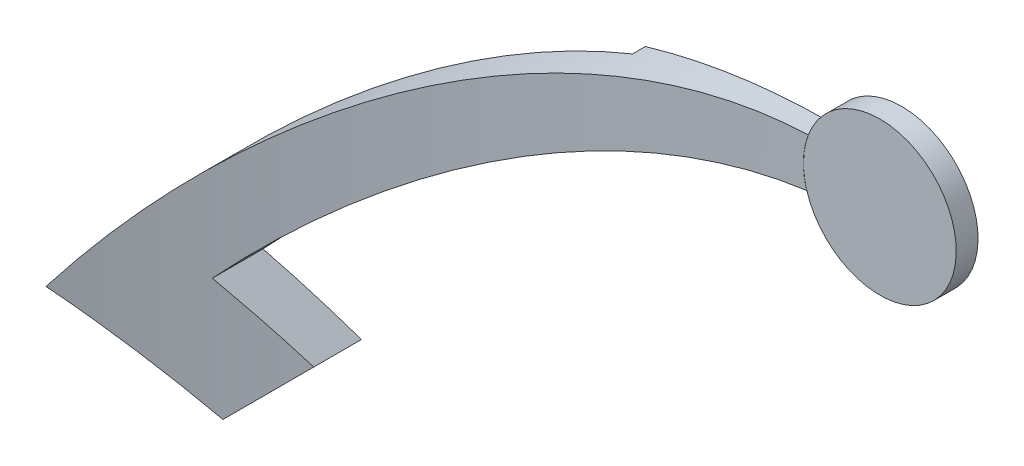
ISO-10303-21;
HEADER;
FILE_DESCRIPTION(('STEP AP214'),'2;1');
FILE_NAME('part.step','',(''),(''),'','','');
FILE_SCHEMA(('AUTOMOTIVE_DESIGN { 1 0 10303 214 1 1 1 1 }'));
ENDSEC;
DATA;
#1=APPLICATION_CONTEXT('core data for automotive mechanical design processes');
#2=APPLICATION_PROTOCOL_DEFINITION('international standard','automotive_design',2000,#1);
#3=PRODUCT_CONTEXT('',#1,'mechanical');
#4=PRODUCT('Part','Part','',(#3));
#5=PRODUCT_RELATED_PRODUCT_CATEGORY('part','',(#4));
#6=PRODUCT_DEFINITION_FORMATION('','',#4);
#7=PRODUCT_DEFINITION_CONTEXT('part definition',#1,'design');
#8=PRODUCT_DEFINITION('design','',#6,#7);
#9=PRODUCT_DEFINITION_SHAPE('','',#8);
#10=(LENGTH_UNIT() NAMED_UNIT(*) SI_UNIT(.MILLI.,.METRE.));
#11=(NAMED_UNIT(*) PLANE_ANGLE_UNIT() SI_UNIT($,.RADIAN.));
#12=(NAMED_UNIT(*) SI_UNIT($,.STERADIAN.) SOLID_ANGLE_UNIT());
#13=UNCERTAINTY_MEASURE_WITH_UNIT(LENGTH_MEASURE(1.E-05),#10,'distance_accuracy_value','');
#14=(GEOMETRIC_REPRESENTATION_CONTEXT(3) GLOBAL_UNCERTAINTY_ASSIGNED_CONTEXT((#13)) GLOBAL_UNIT_ASSIGNED_CONTEXT((#10,
#11,#12)) REPRESENTATION_CONTEXT('',''));
#15=CARTESIAN_POINT('',(0.,0.,0.));
#16=DIRECTION('',(0.,0.,1.));
#17=DIRECTION('',(1.,0.,0.));
#18=AXIS2_PLACEMENT_3D('',#15,#16,#17);
#19=CARTESIAN_POINT('',(-35.5840832931207,-35.5840832931207,45.));
#20=DIRECTION('',(-0.707106781186547,-0.707106781186548,0.));
#21=DIRECTION('',(0.707106781186548,-0.707106781186547,0.));
#22=AXIS2_PLACEMENT_3D('',#19,#20,#21);
#23=PLANE('',#22);
#24=DIRECTION('',(0.,0.,-1.));
#25=VECTOR('',#24,1.);
#26=CARTESIAN_POINT('',(-42.209094678882,-28.9590719073594,45.));
#27=LINE('',#26,#25);
#28=CARTESIAN_POINT('',(-42.209094678882,-28.9590719073594,11.6927556774547));
#29=VERTEX_POINT('',#28);
#30=CARTESIAN_POINT('',(-42.209094678882,-28.9590719073594,7.32366796733275));
#31=VERTEX_POINT('',#30);
#32=EDGE_CURVE('E184',#29,#31,#27,.T.);
#33=ORIENTED_EDGE('',*,*,#32,.T.);
#34=CARTESIAN_POINT('',(-9.9445485422876,-61.2236180439538,73.9490391903972));
#35=DIRECTION('',(-0.707106781186547,-0.707106781186548,0.));
#36=DIRECTION('',(-0.707106781186548,0.707106781186547,0.));
#37=AXIS2_PLACEMENT_3D('',#34,#35,#36);
#38=ELLIPSE('',#37,104.68945532394,74.0266237782838);
#39=CARTESIAN_POINT('',(-48.0616189933059,-23.1065475929356,10.4901551138261));
#40=VERTEX_POINT('',#39);
#41=EDGE_CURVE('E50',#31,#40,#38,.F.);
#42=ORIENTED_EDGE('',*,*,#41,.T.);
#43=DIRECTION('',(0.,0.,-1.));
#44=VECTOR('',#43,1.);
#45=CARTESIAN_POINT('',(-48.0616189933059,-23.1065475929356,45.));
#46=LINE('',#45,#44);
#47=CARTESIAN_POINT('',(-48.0616189933059,-23.1065475929356,15.1397981247711));
#48=VERTEX_POINT('',#47);
#49=EDGE_CURVE('E199',#48,#40,#46,.T.);
#50=ORIENTED_EDGE('',*,*,#49,.F.);
#51=CARTESIAN_POINT('',(-3.27411829727169,-67.8940482889697,84.4899350079603));
#52=DIRECTION('',(-0.707106781186547,-0.707106781186548,0.));
#53=DIRECTION('',(0.707106781186548,-0.707106781186547,0.));
#54=AXIS2_PLACEMENT_3D('',#51,#52,#53);
#55=ELLIPSE('',#54,116.750689114149,82.5552039808172);
#56=EDGE_CURVE('E173',#48,#29,#55,.T.);
#57=ORIENTED_EDGE('',*,*,#56,.T.);
#58=EDGE_LOOP('',(#33,#42,#50,#57));
#59=FACE_BOUND('',#58,.T.);
#60=ADVANCED_FACE('F35',(#59),#23,.F.);
#61=CARTESIAN_POINT('',(0.,0.,2.));
#62=DIRECTION('',(0.,0.,-1.));
#63=DIRECTION('',(-1.,0.,0.));
#64=AXIS2_PLACEMENT_3D('',#61,#62,#63);
#65=CYLINDRICAL_SURFACE('',#64,7.);
#66=DIRECTION('',(0.,0.,-1.));
#67=VECTOR('',#66,1.);
#68=CARTESIAN_POINT('',(-6.69917083103432,-2.03005176698009,45.));
#69=LINE('',#68,#67);
#70=CARTESIAN_POINT('',(-6.69917083103432,-2.03005176698009,2.));
#71=VERTEX_POINT('',#70);
#72=CARTESIAN_POINT('',(-6.69917083103432,-2.03005176698009,0.));
#73=VERTEX_POINT('',#72);
#74=EDGE_CURVE('E196',#71,#73,#69,.T.);
#75=ORIENTED_EDGE('',*,*,#74,.T.);
#76=CARTESIAN_POINT('',(0.,0.,0.));
#77=DIRECTION('',(0.,0.,1.));
#78=DIRECTION('',(1.,0.,0.));
#79=AXIS2_PLACEMENT_3D('',#76,#77,#78);
#80=CIRCLE('',#79,7.);
#81=CARTESIAN_POINT('',(-6.55624058274921,2.45269431872631,0.));
#82=VERTEX_POINT('',#81);
#83=EDGE_CURVE('E202',#73,#82,#80,.T.);
#84=ORIENTED_EDGE('',*,*,#83,.T.);
#85=DIRECTION('',(0.,0.,-1.));
#86=VECTOR('',#85,1.);
#87=CARTESIAN_POINT('',(-6.55624058274921,2.45269431872631,45.));
#88=LINE('',#87,#86);
#89=CARTESIAN_POINT('',(-6.55624058274921,2.45269431872631,2.));
#90=VERTEX_POINT('',#89);
#91=EDGE_CURVE('E193',#90,#82,#88,.T.);
#92=ORIENTED_EDGE('',*,*,#91,.F.);
#93=CARTESIAN_POINT('',(0.,0.,2.));
#94=DIRECTION('',(0.,0.,1.));
#95=DIRECTION('',(1.,0.,0.));
#96=AXIS2_PLACEMENT_3D('',#93,#94,#95);
#97=CIRCLE('',#96,7.);
#98=EDGE_CURVE('E207',#71,#90,#97,.T.);
#99=ORIENTED_EDGE('',*,*,#98,.F.);
#100=EDGE_LOOP('',(#75,#84,#92,#99));
#101=FACE_BOUND('',#100,.T.);
#102=ADVANCED_FACE('F37',(#101),#65,.T.);
#103=CARTESIAN_POINT('',(0.,0.,2.));
#104=DIRECTION('',(0.,0.,1.));
#105=DIRECTION('',(1.,0.,0.));
#106=AXIS2_PLACEMENT_3D('',#103,#104,#105);
#107=PLANE('',#106);
#108=ORIENTED_EDGE('',*,*,#98,.T.);
#109=EDGE_CURVE('E203',#90,#71,#97,.T.);
#110=ORIENTED_EDGE('',*,*,#109,.T.);
#111=EDGE_LOOP('',(#108,#110));
#112=FACE_BOUND('',#111,.T.);
#113=ADVANCED_FACE('F226',(#112),#107,.T.);
#114=CARTESIAN_POINT('',(0.,0.,0.));
#115=DIRECTION('',(0.,0.,1.));
#116=DIRECTION('',(1.,0.,0.));
#117=AXIS2_PLACEMENT_3D('',#114,#115,#116);
#118=PLANE('',#117);
#119=CARTESIAN_POINT('',(-0.329565776706658,-65.6553273861561,0.));
#120=DIRECTION('',(0.,0.,1.));
#121=DIRECTION('',(1.,0.,0.));
#122=AXIS2_PLACEMENT_3D('',#119,#120,#121);
#123=CIRCLE('',#122,63.9433152578456);
#124=CARTESIAN_POINT('',(-13.3328565018262,-3.04812335593085,0.));
#125=VERTEX_POINT('',#124);
#126=EDGE_CURVE('E121',#125,#73,#123,.F.);
#127=ORIENTED_EDGE('',*,*,#126,.F.);
#128=DIRECTION('',(0.,1.,0.));
#129=VECTOR('',#128,1.);
#130=CARTESIAN_POINT('',(-13.3328565018262,-34.220255051597,0.));
#131=LINE('',#130,#129);
#132=CARTESIAN_POINT('',(-13.3328565018262,0.,0.));
#133=VERTEX_POINT('',#132);
#134=EDGE_CURVE('E105',#125,#133,#131,.T.);
#135=ORIENTED_EDGE('',*,*,#134,.T.);
#136=DIRECTION('',(-1.,0.,0.));
#137=VECTOR('',#136,1.);
#138=CARTESIAN_POINT('',(0.,0.,0.));
#139=LINE('',#138,#137);
#140=CARTESIAN_POINT('',(-23.4995027128291,0.,0.));
#141=VERTEX_POINT('',#140);
#142=EDGE_CURVE('E110',#133,#141,#139,.T.);
#143=ORIENTED_EDGE('',*,*,#142,.T.);
#144=CARTESIAN_POINT('',(-6.53554864061653,-57.4387925220281,0.));
#145=DIRECTION('',(0.,0.,1.));
#146=DIRECTION('',(1.,0.,0.));
#147=AXIS2_PLACEMENT_3D('',#144,#145,#146);
#148=CIRCLE('',#147,59.8914904151894);
#149=EDGE_CURVE('E182',#82,#141,#148,.T.);
#150=ORIENTED_EDGE('',*,*,#149,.F.);
#151=ORIENTED_EDGE('',*,*,#83,.F.);
#152=EDGE_LOOP('',(#127,#135,#143,#150,#151));
#153=FACE_BOUND('',#152,.T.);
#154=ADVANCED_FACE('F119',(#153),#118,.F.);
#155=CARTESIAN_POINT('',(-0.329565776706658,-65.6553273861561,45.));
#156=DIRECTION('',(0.,0.,-1.));
#157=DIRECTION('',(-1.,0.,0.));
#158=AXIS2_PLACEMENT_3D('',#155,#156,#157);
#159=CYLINDRICAL_SURFACE('',#158,63.9433152578456);
#160=ORIENTED_EDGE('',*,*,#49,.T.);
#161=CARTESIAN_POINT('',(-48.0616189933059,-23.1065475929356,10.4901551138261));
#162=CARTESIAN_POINT('',(-47.5076406890203,-22.4850994987697,10.1573967660847));
#163=CARTESIAN_POINT('',(-46.9409325879899,-21.8737747227003,9.82687760220049));
#164=CARTESIAN_POINT('',(-45.782206093157,-20.6719722519872,9.17214532539775));
#165=CARTESIAN_POINT('',(-45.1901853173552,-20.0814965288909,8.84793281014923));
#166=CARTESIAN_POINT('',(-43.9806025660395,-18.9216452307571,8.20744828710972));
#167=CARTESIAN_POINT('',(-43.3630204901772,-18.3522869552314,7.89118285514154));
#168=CARTESIAN_POINT('',(-42.1030835501203,-17.2360209890771,7.26873119161367));
#169=CARTESIAN_POINT('',(-41.4607294297363,-16.689112625379,6.96254465793376));
#170=CARTESIAN_POINT('',(-39.536754127791,-15.115915963667,6.08010799750546));
#171=CARTESIAN_POINT('',(-38.2211181655229,-14.1215944669166,5.52017465086399));
#172=CARTESIAN_POINT('',(-35.5009304991416,-12.2281132423495,4.4584437653621));
#173=CARTESIAN_POINT('',(-34.0963957073024,-11.3289355006571,3.95663521983494));
#174=CARTESIAN_POINT('',(-31.9296588113765,-10.0596477819164,3.25837685623826));
#175=CARTESIAN_POINT('',(-31.1987199569451,-9.65042824258387,3.03503421630335));
#176=CARTESIAN_POINT('',(-29.71693296425,-8.8588883401176,2.60768986001694));
#177=CARTESIAN_POINT('',(-28.9660871117812,-8.47656490693388,2.40368593532536));
#178=CARTESIAN_POINT('',(-27.445552322729,-7.74000604859893,2.01663105946206));
#179=CARTESIAN_POINT('',(-26.6758653359426,-7.38576773297376,1.83357795120449));
#180=CARTESIAN_POINT('',(-25.1188685865181,-6.70654190927557,1.48997137957799));
#181=CARTESIAN_POINT('',(-24.3315610894292,-6.38155066744672,1.32941504275222));
#182=CARTESIAN_POINT('',(-22.7161133041659,-5.75236960568672,1.02768488826264));
#183=CARTESIAN_POINT('',(-21.8874623255342,-5.44912923802535,0.887260698509145));
#184=CARTESIAN_POINT('',(-20.2146169046235,-4.87610346817176,0.633402975491693));
#185=CARTESIAN_POINT('',(-19.3704229200604,-4.60631708261887,0.519968648786049));
#186=CARTESIAN_POINT('',(-17.6671953032793,-4.10092838630861,0.321344042496089));
#187=CARTESIAN_POINT('',(-16.8081416756833,-3.86537692416627,0.236195539072436));
#188=CARTESIAN_POINT('',(-15.078529959684,-3.42983120730705,0.0955509178788475));
#189=CARTESIAN_POINT('',(-14.2079700582759,-3.22984262963329,0.0400595315607913));
#190=CARTESIAN_POINT('',(-13.3328565018267,-3.04812335593097,0.));
#191=B_SPLINE_CURVE_WITH_KNOTS('',3,(#161,#162,#163,#164,#165,#166,#167,#168,#169,#170,#171,
#172,#173,#174,#175,#176,#177,#178,#179,#180,#181,#182,#183,#184,#185,#186,#187,#188,#189,#190),
.UNSPECIFIED.,.F.,.F.,(4,2,2,2,2,2,2,2,2,2,2,2,2,2,4),(0.,2.68954959187786,5.37935283796327,
8.07131298866402,10.7631923728453,15.9821761203666,21.2001699659842,23.8003228808297,
26.4001785186181,28.9997662352759,31.5990216097701,34.2783638967067,36.9576274072304,
39.6408305874597,42.3244617142018),.UNSPECIFIED.);
#192=EDGE_CURVE('E147',#40,#125,#191,.T.);
#193=ORIENTED_EDGE('',*,*,#192,.T.);
#194=ORIENTED_EDGE('',*,*,#126,.T.);
#195=ORIENTED_EDGE('',*,*,#74,.F.);
#196=CARTESIAN_POINT('',(-6.69917083103432,-2.03005176698009,2.00581096305508));
#197=VERTEX_POINT('',#196);
#198=EDGE_CURVE('E197',#197,#71,#69,.T.);
#199=ORIENTED_EDGE('',*,*,#198,.F.);
#200=CARTESIAN_POINT('',(-6.69917083103432,-2.0300517669801,2.00581096305508));
#201=CARTESIAN_POINT('',(-7.50254570219854,-2.11045431644717,2.03914462176974));
#202=CARTESIAN_POINT('',(-8.30388958942229,-2.20606949284512,2.0842011850145));
#203=CARTESIAN_POINT('',(-9.90074232476401,-2.42725628217593,2.19723148069816));
#204=CARTESIAN_POINT('',(-10.6962516442467,-2.55282544707744,2.26520334054011));
#205=CARTESIAN_POINT('',(-12.2791037424407,-2.83334235495889,2.42347218895302));
#206=CARTESIAN_POINT('',(-13.0664530360524,-2.98826439058415,2.51374966306348));
#207=CARTESIAN_POINT('',(-14.6321140831516,-3.3269537092637,2.71597428893903));
#208=CARTESIAN_POINT('',(-15.4104256961544,-3.51072144006247,2.82792177707356));
#209=CARTESIAN_POINT('',(-16.95035695795,-3.90483405955228,3.07172465749408));
#210=CARTESIAN_POINT('',(-17.7120603115694,-4.11495470164663,3.20341371879868));
#211=CARTESIAN_POINT('',(-19.2238345364824,-4.56215364233594,3.48647803843966));
#212=CARTESIAN_POINT('',(-19.9739041223335,-4.79923489609666,3.63785545508807));
#213=CARTESIAN_POINT('',(-22.2048845919056,-5.54976364517395,4.12015691543529));
#214=CARTESIAN_POINT('',(-23.6667641347681,-6.10254676299516,4.47928170988763));
#215=CARTESIAN_POINT('',(-26.525593155083,-7.30369828558628,5.26291197838196));
#216=CARTESIAN_POINT('',(-27.9227550493831,-7.95171977861777,5.68718040359195));
#217=CARTESIAN_POINT('',(-30.6520336196508,-9.33802934250386,6.59334469823989));
#218=CARTESIAN_POINT('',(-31.9841486741433,-10.0763196619563,7.07524200320756));
#219=CARTESIAN_POINT('',(-34.5817406210783,-11.6383061563908,8.08873743753809));
#220=CARTESIAN_POINT('',(-35.8470634434638,-12.4621878048498,8.62044324460001));
#221=CARTESIAN_POINT('',(-38.3047697558859,-14.1880013199949,9.72343989067866));
#222=CARTESIAN_POINT('',(-39.4971655692745,-15.0899199372923,10.2947240066823));
#223=CARTESIAN_POINT('',(-41.3219006512592,-16.5725272841568,11.2213000534085));
#224=CARTESIAN_POINT('',(-41.9791791583244,-17.1290876036939,11.5665665243754));
#225=CARTESIAN_POINT('',(-43.2681721597276,-18.2658576014905,12.2654610719787));
#226=CARTESIAN_POINT('',(-43.8998909396338,-18.8460632821407,12.6190877309878));
#227=CARTESIAN_POINT('',(-45.134866747434,-20.0268341469729,13.3313424293055));
#228=CARTESIAN_POINT('',(-45.7382361322276,-20.6272992324183,13.6899418442698));
#229=CARTESIAN_POINT('',(-46.9192783962792,-21.8504348711682,14.4118281310364));
#230=CARTESIAN_POINT('',(-47.4969484054507,-22.4731078907169,14.7751155205725));
#231=CARTESIAN_POINT('',(-48.0616189933059,-23.1065475929356,15.1397981247711));
#232=B_SPLINE_CURVE_WITH_KNOTS('',3,(#200,#201,#202,#203,#204,#205,#206,#207,#208,#209,#210,
#211,#212,#213,#214,#215,#216,#217,#218,#219,#220,#221,#222,#223,#224,#225,#226,#227,#228,#229,
#230,#231),.UNSPECIFIED.,.F.,.F.,(4,2,2,2,2,2,2,2,2,2,2,2,2,2,2,4),(0.,2.42396614410938,
4.84773425404532,7.2693893496953,9.69108203812793,12.0934119986895,14.4960055340744,
19.3005773658444,24.088063153342,28.8756682214893,33.6738732723236,38.4712652597832,
41.2543407108253,44.0369475767378,46.8073892450748,49.5781395414627),.UNSPECIFIED.);
#233=EDGE_CURVE('E165',#197,#48,#232,.T.);
#234=ORIENTED_EDGE('',*,*,#233,.T.);
#235=EDGE_LOOP('',(#160,#193,#194,#195,#199,#234));
#236=FACE_BOUND('',#235,.T.);
#237=ADVANCED_FACE('F155',(#236),#159,.F.);
#238=CARTESIAN_POINT('',(0.,0.,45.));
#239=DIRECTION('',(0.,0.,-1.));
#240=DIRECTION('',(-1.,0.,0.));
#241=AXIS2_PLACEMENT_3D('',#238,#239,#240);
#242=CYLINDRICAL_SURFACE('',#241,7.);
#243=CARTESIAN_POINT('',(-6.69917083103432,-2.03005176698009,2.00581096305508));
#244=CARTESIAN_POINT('',(-6.75698938030169,-1.83932940455152,2.00821695310317));
#245=CARTESIAN_POINT('',(-6.80662093014655,-1.64612249797007,2.01033383644358));
#246=CARTESIAN_POINT('',(-6.88924101513594,-1.25618099755406,2.01391102782344));
#247=CARTESIAN_POINT('',(-6.92222996731225,-1.05944649224234,2.0153713523149));
#248=CARTESIAN_POINT('',(-6.97064320069171,-0.669166288714337,2.01752798945722));
#249=CARTESIAN_POINT('',(-6.98651326097042,-0.475675847589639,2.01824367405878));
#250=CARTESIAN_POINT('',(-7.00213229703751,-0.0880576482576737,2.01894802081468));
#251=CARTESIAN_POINT('',(-7.00188276232776,0.106070049407468,2.01893675014201));
#252=CARTESIAN_POINT('',(-6.98580071270422,0.481182349755861,2.01821154489904));
#253=CARTESIAN_POINT('',(-6.97096948096609,0.662210744905731,2.01754276001972));
#254=CARTESIAN_POINT('',(-6.92728702525015,1.02256404341118,2.01559638633014));
#255=CARTESIAN_POINT('',(-6.89843601021886,1.20188897211408,2.01431880659319));
#256=CARTESIAN_POINT('',(-6.82596403106263,1.56232237493003,2.01116509502897));
#257=CARTESIAN_POINT('',(-6.78198269734891,1.74335833460944,2.00927443075064));
#258=CARTESIAN_POINT('',(-6.67974415526697,2.1013666437157,2.0049916863251));
#259=CARTESIAN_POINT('',(-6.62148550568538,2.27833858092903,2.00259955556125));
#260=CARTESIAN_POINT('',(-6.55624058274992,2.45269431872442,2.00000000000003));
#261=B_SPLINE_CURVE_WITH_KNOTS('',3,(#243,#244,#245,#246,#247,#248,#249,#250,#251,#252,#253,
#254,#255,#256,#257,#258,#259,#260),.UNSPECIFIED.,.F.,.F.,(4,2,2,2,2,2,2,2,4),(0.,
0.597743782367161,1.19547258567025,1.77722993135481,2.35893352088676,2.90329817151073,
3.4476547093406,4.0059945612501,4.56439079760558),.UNSPECIFIED.);
#262=EDGE_CURVE('E174',#197,#90,#261,.T.);
#263=ORIENTED_EDGE('',*,*,#262,.F.);
#264=ORIENTED_EDGE('',*,*,#198,.T.);
#265=ORIENTED_EDGE('',*,*,#109,.F.);
#266=EDGE_LOOP('',(#263,#264,#265));
#267=FACE_BOUND('',#266,.T.);
#268=ADVANCED_FACE('F159',(#267),#242,.F.);
#269=CARTESIAN_POINT('',(-6.53554864061653,-57.4387925220281,45.));
#270=DIRECTION('',(0.,0.,-1.));
#271=DIRECTION('',(-1.,0.,0.));
#272=AXIS2_PLACEMENT_3D('',#269,#270,#271);
#273=CYLINDRICAL_SURFACE('',#272,59.8914904151894);
#274=DIRECTION('',(0.,0.,-1.));
#275=VECTOR('',#274,1.);
#276=CARTESIAN_POINT('',(-23.4995027128291,0.,45.));
#277=LINE('',#276,#275);
#278=CARTESIAN_POINT('',(-23.4995027128291,0.,1.17401431615829));
#279=VERTEX_POINT('',#278);
#280=EDGE_CURVE('E11',#141,#279,#277,.F.);
#281=ORIENTED_EDGE('',*,*,#280,.T.);
#282=CARTESIAN_POINT('',(-23.4995027128291,0.,1.17401431615829));
#283=CARTESIAN_POINT('',(-24.2898724547445,-0.233407955311336,1.32120509146465));
#284=CARTESIAN_POINT('',(-25.0732844965539,-0.482535617480885,1.48046572515998));
#285=CARTESIAN_POINT('',(-26.6246442708296,-1.01105414426337,1.82175400353782));
#286=CARTESIAN_POINT('',(-27.3925946317853,-1.29043981260327,2.00377773989129));
#287=CARTESIAN_POINT('',(-28.9107824877938,-1.87800291226366,2.38902435362649));
#288=CARTESIAN_POINT('',(-29.6610413844691,-2.18614305605865,2.59221981526424));
#289=CARTESIAN_POINT('',(-31.1436619570378,-2.83032352877533,3.01855317009253));
#290=CARTESIAN_POINT('',(-31.8760228883885,-3.16636501582479,3.24169189111642));
#291=CARTESIAN_POINT('',(-34.0364399769591,-4.21061007723192,3.93618339972213));
#292=CARTESIAN_POINT('',(-35.4368595254919,-4.95844849512081,4.43493211549151));
#293=CARTESIAN_POINT('',(-38.1570538631768,-6.55109879868737,5.49374089229143));
#294=CARTESIAN_POINT('',(-39.4768042365114,-7.39593982323216,6.05381937397967));
#295=CARTESIAN_POINT('',(-42.0247706998243,-9.16973192216327,7.2200905033521));
#296=CARTESIAN_POINT('',(-43.2534428408969,-10.0982038652211,7.82601763396912));
#297=CARTESIAN_POINT('',(-45.6247042654758,-12.0364370081718,9.07482761112926));
#298=CARTESIAN_POINT('',(-46.7672916728323,-13.046199978748,9.71771126257303));
#299=CARTESIAN_POINT('',(-48.9653757385486,-15.1421278245925,11.0288159971658));
#300=CARTESIAN_POINT('',(-50.0208342602868,-16.2283257744312,11.6970479905575));
#301=CARTESIAN_POINT('',(-52.0427401795157,-18.4725699757365,13.0461710301396));
#302=CARTESIAN_POINT('',(-53.0092179505157,-19.6305914826884,13.7270576605806));
#303=CARTESIAN_POINT('',(-54.4378647175077,-21.4798277211979,14.7824620709848));
#304=CARTESIAN_POINT('',(-54.9314563819002,-22.1469139617647,15.1571301959279));
#305=CARTESIAN_POINT('',(-55.8901223654329,-23.5005773700295,15.9032492554413));
#306=CARTESIAN_POINT('',(-56.3552523883386,-24.1871123497196,16.2747051671777));
#307=CARTESIAN_POINT('',(-56.806558543863,-24.8839743308536,16.643777245059));
#308=B_SPLINE_CURVE_WITH_KNOTS('',3,(#282,#283,#284,#285,#286,#287,#288,#289,#290,#291,#292,
#293,#294,#295,#296,#297,#298,#299,#300,#301,#302,#303,#304,#305,#306,#307),.UNSPECIFIED.,.F.,
.F.,(4,2,2,2,2,2,2,2,2,2,2,2,4),(0.,2.51110597282216,5.02178138972917,7.52924515669854,
10.0368130554472,15.0221708842496,20.009030215212,24.9689443800812,29.9289666111808,
34.8911484756926,39.8516301740425,42.5825515659723,45.3079448836172),.UNSPECIFIED.);
#309=CARTESIAN_POINT('',(-56.806558543863,-24.8839743308536,16.6437772450591));
#310=VERTEX_POINT('',#309);
#311=EDGE_CURVE('E108',#279,#310,#308,.T.);
#312=ORIENTED_EDGE('',*,*,#311,.T.);
#313=DIRECTION('',(0.,0.,-1.));
#314=VECTOR('',#313,1.);
#315=CARTESIAN_POINT('',(-56.806558543863,-24.8839743308536,45.));
#316=LINE('',#315,#314);
#317=CARTESIAN_POINT('',(-56.806558543863,-24.8839743308536,21.6437772450591));
#318=VERTEX_POINT('',#317);
#319=EDGE_CURVE('E190',#318,#310,#316,.T.);
#320=ORIENTED_EDGE('',*,*,#319,.F.);
#321=CARTESIAN_POINT('',(-56.806558543863,-24.8839743308536,21.643777245059));
#322=CARTESIAN_POINT('',(-56.32116466368,-24.1344854145388,21.2302952924433));
#323=CARTESIAN_POINT('',(-55.8200047148887,-23.3972825011278,20.8131323428714));
#324=CARTESIAN_POINT('',(-54.7865991233197,-21.9476666278864,19.974292404109));
#325=CARTESIAN_POINT('',(-54.2543539997939,-21.2352532542845,19.5526154904164));
#326=CARTESIAN_POINT('',(-53.1588543435592,-19.8349569759415,18.7073084890285));
#327=CARTESIAN_POINT('',(-52.5955799906122,-19.1470902238085,18.2836773150781));
#328=CARTESIAN_POINT('',(-51.4387177680145,-17.7968136834828,17.4373667417599));
#329=CARTESIAN_POINT('',(-50.8451297107995,-17.1344040528491,17.0146873482981));
#330=CARTESIAN_POINT('',(-49.0081332282762,-15.1741800356505,15.7440939280941));
#331=CARTESIAN_POINT('',(-47.7183246614803,-13.9159530439648,14.9012984772444));
#332=CARTESIAN_POINT('',(-45.0189351372456,-11.5118413526666,13.2492454158493));
#333=CARTESIAN_POINT('',(-43.6093901719421,-10.3659231151352,12.4399778350569));
#334=CARTESIAN_POINT('',(-40.908170543815,-8.36879444056421,10.9984817519466));
#335=CARTESIAN_POINT('',(-39.6337257261096,-7.49976728711636,10.3586454133431));
#336=CARTESIAN_POINT('',(-37.0049778439384,-5.85382095163984,9.12616362574853));
#337=CARTESIAN_POINT('',(-35.6506802910922,-5.07689542366272,8.53351492637907));
#338=CARTESIAN_POINT('',(-32.8742185567545,-3.6270653548504,7.40929994341455));
#339=CARTESIAN_POINT('',(-31.4524984017168,-2.95357813213978,6.87739618328146));
#340=CARTESIAN_POINT('',(-29.2686551771684,-2.02378360088143,6.13025940902332));
#341=CARTESIAN_POINT('',(-28.5320476840963,-1.72721916089556,5.88963422782407));
#342=CARTESIAN_POINT('',(-27.042658525746,-1.16194806811685,5.42650471972515));
#343=CARTESIAN_POINT('',(-26.289878781662,-0.893238128180223,5.20399825527957));
#344=CARTESIAN_POINT('',(-24.7866329886999,-0.390547353127471,4.78316800071452));
#345=CARTESIAN_POINT('',(-24.0365075786382,-0.155912933365266,4.5844076098017));
#346=CARTESIAN_POINT('',(-22.5231433213037,0.28475933189206,4.20640677946036));
#347=CARTESIAN_POINT('',(-21.7599061119201,0.490800720374996,4.02716392219075));
#348=CARTESIAN_POINT('',(-20.2216321280995,0.873383408214141,3.68917037662394));
#349=CARTESIAN_POINT('',(-19.4465960656531,1.04992647997989,3.53041845725702));
#350=CARTESIAN_POINT('',(-17.88627843964,1.37265327786305,3.23430773425707));
#351=CARTESIAN_POINT('',(-17.1009981582723,1.51884076536016,3.09694628064594));
#352=CARTESIAN_POINT('',(-15.5116353643081,1.78179114182981,2.84276262963805));
#353=CARTESIAN_POINT('',(-14.7074408332036,1.8981537076502,2.72622564922344));
#354=CARTESIAN_POINT('',(-13.0919800705161,2.09830795270004,2.51655637893189));
#355=CARTESIAN_POINT('',(-12.2807139135475,2.18209997516507,2.4234238424174));
#356=CARTESIAN_POINT('',(-10.6522409779822,2.31663701110582,2.26101768081612));
#357=CARTESIAN_POINT('',(-9.83502909413225,2.36734907897784,2.19176787370363));
#358=CARTESIAN_POINT('',(-8.19746241997349,2.4352524745279,2.0775721011218));
#359=CARTESIAN_POINT('',(-7.37710740249874,2.45244133175616,2.03262792700109));
#360=CARTESIAN_POINT('',(-6.55624058274924,2.45269431872632,2.));
#361=B_SPLINE_CURVE_WITH_KNOTS('',3,(#321,#322,#323,#324,#325,#326,#327,#328,#329,#330,#331,
#332,#333,#334,#335,#336,#337,#338,#339,#340,#341,#342,#343,#344,#345,#346,#347,#348,#349,#350,
#351,#352,#353,#354,#355,#356,#357,#358,#359,#360),.UNSPECIFIED.,.F.,.F.,(4,2,2,2,2,2,2,2,2,2,2,
2,2,2,2,2,2,2,2,4),(0.,2.9518167921214,5.90358429070936,8.85725963127656,11.8109532497668,
17.7713348512252,23.7299310905465,28.7350671245104,33.7398580959534,38.7153316326827,
41.2038253895893,43.692025141158,46.1233335990048,48.554340521753,50.9852013246214,
53.4157607380073,55.8774120330196,58.3390373859041,60.8031106384626,63.2673654708614),.UNSPECIFIED.);
#362=EDGE_CURVE('E317',#318,#90,#361,.T.);
#363=ORIENTED_EDGE('',*,*,#362,.T.);
#364=ORIENTED_EDGE('',*,*,#91,.T.);
#365=ORIENTED_EDGE('',*,*,#149,.T.);
#366=EDGE_LOOP('',(#281,#312,#320,#363,#364,#365));
#367=FACE_BOUND('',#366,.T.);
#368=ADVANCED_FACE('F135',(#367),#273,.T.);
#369=CARTESIAN_POINT('',(-40.8452664373583,-40.8452664373583,45.));
#370=DIRECTION('',(0.707106781186547,0.707106781186547,0.));
#371=DIRECTION('',(-0.707106781186548,0.707106781186548,0.));
#372=AXIS2_PLACEMENT_3D('',#369,#370,#371);
#373=PLANE('',#372);
#374=ORIENTED_EDGE('',*,*,#319,.T.);
#375=CARTESIAN_POINT('',(-9.9445485422876,-71.745984332429,73.9490391903972));
#376=DIRECTION('',(0.707106781186547,0.707106781186547,0.));
#377=DIRECTION('',(-0.707106781186548,0.707106781186548,0.));
#378=AXIS2_PLACEMENT_3D('',#375,#376,#377);
#379=ELLIPSE('',#378,104.68945532394,74.0266237782838);
#380=CARTESIAN_POINT('',(-47.4702778231196,-34.220255051597,10.1386899517879));
#381=VERTEX_POINT('',#380);
#382=EDGE_CURVE('E122',#310,#381,#379,.F.);
#383=ORIENTED_EDGE('',*,*,#382,.T.);
#384=DIRECTION('',(0.,0.,-1.));
#385=VECTOR('',#384,1.);
#386=CARTESIAN_POINT('',(-47.4702778231196,-34.220255051597,45.));
#387=LINE('',#386,#385);
#388=CARTESIAN_POINT('',(-47.4702778231196,-34.220255051597,14.7614531122518));
#389=VERTEX_POINT('',#388);
#390=EDGE_CURVE('E187',#389,#381,#387,.T.);
#391=ORIENTED_EDGE('',*,*,#390,.F.);
#392=CARTESIAN_POINT('',(-3.27411829727169,-78.4164145774449,84.4899350079603));
#393=DIRECTION('',(0.707106781186547,0.707106781186547,0.));
#394=DIRECTION('',(0.707106781186548,-0.707106781186548,0.));
#395=AXIS2_PLACEMENT_3D('',#392,#393,#394);
#396=ELLIPSE('',#395,116.750689114149,82.5552039808172);
#397=EDGE_CURVE('E58',#389,#318,#396,.T.);
#398=ORIENTED_EDGE('',*,*,#397,.T.);
#399=EDGE_LOOP('',(#374,#383,#391,#398));
#400=FACE_BOUND('',#399,.T.);
#401=ADVANCED_FACE('F289',(#400),#373,.F.);
#402=CARTESIAN_POINT('',(-6.62501138576133,6.62501138576132,45.));
#403=DIRECTION('',(-0.707106781186548,0.707106781186547,0.));
#404=DIRECTION('',(-0.707106781186547,-0.707106781186548,0.));
#405=AXIS2_PLACEMENT_3D('',#402,#403,#404);
#406=PLANE('',#405);
#407=ORIENTED_EDGE('',*,*,#390,.T.);
#408=CARTESIAN_POINT('',(-9.9445485422876,3.30547422923504,73.9490391903972));
#409=DIRECTION('',(-0.707106781186548,0.707106781186547,0.));
#410=DIRECTION('',(0.707106781186547,0.707106781186548,0.));
#411=AXIS2_PLACEMENT_3D('',#408,#409,#410);
#412=ELLIPSE('',#411,104.68945532394,74.0266237782838);
#413=EDGE_CURVE('E43',#381,#31,#412,.F.);
#414=ORIENTED_EDGE('',*,*,#413,.T.);
#415=ORIENTED_EDGE('',*,*,#32,.F.);
#416=CARTESIAN_POINT('',(-3.27411829727169,9.97590447425097,84.4899350079603));
#417=DIRECTION('',(-0.707106781186548,0.707106781186547,0.));
#418=DIRECTION('',(-0.707106781186547,-0.707106781186548,0.));
#419=AXIS2_PLACEMENT_3D('',#416,#417,#418);
#420=ELLIPSE('',#419,116.750689114149,82.5552039808172);
#421=EDGE_CURVE('E206',#29,#389,#420,.T.);
#422=ORIENTED_EDGE('',*,*,#421,.T.);
#423=EDGE_LOOP('',(#407,#414,#415,#422));
#424=FACE_BOUND('',#423,.T.);
#425=ADVANCED_FACE('F211',(#424),#406,.F.);
#426=CARTESIAN_POINT('',(-3.27411829727169,5.,84.4899350079603));
#427=DIRECTION('',(0.,-1.,0.));
#428=DIRECTION('',(0.,0.,-1.));
#429=AXIS2_PLACEMENT_3D('',#426,#427,#428);
#430=CYLINDRICAL_SURFACE('',#429,82.5552039808172);
#431=ORIENTED_EDGE('',*,*,#233,.F.);
#432=ORIENTED_EDGE('',*,*,#262,.T.);
#433=ORIENTED_EDGE('',*,*,#362,.F.);
#434=ORIENTED_EDGE('',*,*,#397,.F.);
#435=ORIENTED_EDGE('',*,*,#421,.F.);
#436=ORIENTED_EDGE('',*,*,#56,.F.);
#437=EDGE_LOOP('',(#431,#432,#433,#434,#435,#436));
#438=FACE_BOUND('',#437,.T.);
#439=ADVANCED_FACE('F143',(#438),#430,.F.);
#440=CARTESIAN_POINT('',(0.,0.,0.));
#441=DIRECTION('',(0.,1.,0.));
#442=DIRECTION('',(0.,0.,1.));
#443=AXIS2_PLACEMENT_3D('',#440,#441,#442);
#444=PLANE('',#443);
#445=ORIENTED_EDGE('',*,*,#142,.F.);
#446=CARTESIAN_POINT('',(-9.9445485422876,0.,73.9490391903972));
#447=DIRECTION('',(0.,1.,0.));
#448=DIRECTION('',(0.,0.,1.));
#449=AXIS2_PLACEMENT_3D('',#446,#447,#448);
#450=CIRCLE('',#449,74.0266237782838);
#451=EDGE_CURVE('E101',#279,#133,#450,.F.);
#452=ORIENTED_EDGE('',*,*,#451,.F.);
#453=ORIENTED_EDGE('',*,*,#280,.F.);
#454=EDGE_LOOP('',(#445,#452,#453));
#455=FACE_BOUND('',#454,.T.);
#456=ADVANCED_FACE('F113',(#455),#444,.F.);
#457=CARTESIAN_POINT('',(-9.9445485422876,-34.220255051597,73.9490391903972));
#458=DIRECTION('',(0.,1.,0.));
#459=DIRECTION('',(0.,0.,1.));
#460=AXIS2_PLACEMENT_3D('',#457,#458,#459);
#461=CYLINDRICAL_SURFACE('',#460,74.0266237782838);
#462=ORIENTED_EDGE('',*,*,#41,.F.);
#463=ORIENTED_EDGE('',*,*,#413,.F.);
#464=ORIENTED_EDGE('',*,*,#382,.F.);
#465=ORIENTED_EDGE('',*,*,#311,.F.);
#466=ORIENTED_EDGE('',*,*,#451,.T.);
#467=ORIENTED_EDGE('',*,*,#134,.F.);
#468=ORIENTED_EDGE('',*,*,#192,.F.);
#469=EDGE_LOOP('',(#462,#463,#464,#465,#466,#467,#468));
#470=FACE_BOUND('',#469,.T.);
#471=ADVANCED_FACE('F103',(#470),#461,.T.);
#472=CLOSED_SHELL('',(#60,#102,#113,#154,#237,#268,#368,#401,#425,#439,#456,#471));
#473=MANIFOLD_SOLID_BREP('B2',#472);
#474=ADVANCED_BREP_SHAPE_REPRESENTATION('',(#18,#473),#14);
#475=SHAPE_DEFINITION_REPRESENTATION(#9,#474);
ENDSEC;
END-ISO-10303-21;
